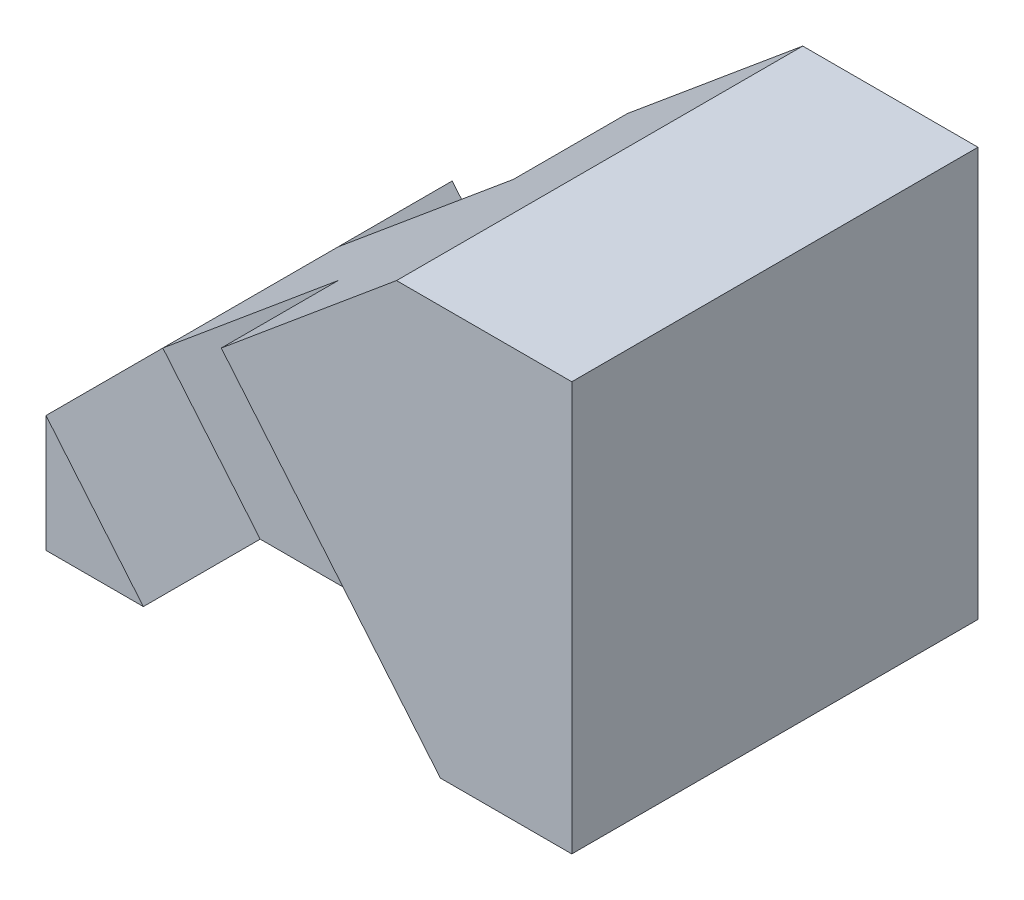
ISO-10303-21;
HEADER;
FILE_DESCRIPTION(('STEP AP214'),'2;1');
FILE_NAME('part.step','',(''),(''),'','','');
FILE_SCHEMA(('AUTOMOTIVE_DESIGN { 1 0 10303 214 1 1 1 1 }'));
ENDSEC;
DATA;
#1=APPLICATION_CONTEXT('core data for automotive mechanical design processes');
#2=APPLICATION_PROTOCOL_DEFINITION('international standard','automotive_design',2000,#1);
#3=PRODUCT_CONTEXT('',#1,'mechanical');
#4=PRODUCT('Part','Part','',(#3));
#5=PRODUCT_RELATED_PRODUCT_CATEGORY('part','',(#4));
#6=PRODUCT_DEFINITION_FORMATION('','',#4);
#7=PRODUCT_DEFINITION_CONTEXT('part definition',#1,'design');
#8=PRODUCT_DEFINITION('design','',#6,#7);
#9=PRODUCT_DEFINITION_SHAPE('','',#8);
#10=(LENGTH_UNIT() NAMED_UNIT(*) SI_UNIT(.MILLI.,.METRE.));
#11=(NAMED_UNIT(*) PLANE_ANGLE_UNIT() SI_UNIT($,.RADIAN.));
#12=(NAMED_UNIT(*) SI_UNIT($,.STERADIAN.) SOLID_ANGLE_UNIT());
#13=UNCERTAINTY_MEASURE_WITH_UNIT(LENGTH_MEASURE(1.E-05),#10,'distance_accuracy_value','');
#14=(GEOMETRIC_REPRESENTATION_CONTEXT(3) GLOBAL_UNCERTAINTY_ASSIGNED_CONTEXT((#13)) GLOBAL_UNIT_ASSIGNED_CONTEXT((#10,
#11,#12)) REPRESENTATION_CONTEXT('',''));
#15=CARTESIAN_POINT('',(0.,0.,0.));
#16=DIRECTION('',(0.,0.,1.));
#17=DIRECTION('',(1.,0.,0.));
#18=AXIS2_PLACEMENT_3D('',#15,#16,#17);
#19=CARTESIAN_POINT('',(0.,0.,0.));
#20=DIRECTION('',(0.,0.,1.));
#21=DIRECTION('',(1.,0.,0.));
#22=AXIS2_PLACEMENT_3D('',#19,#20,#21);
#23=PLANE('',#22);
#24=DIRECTION('',(0.,-1.,0.));
#25=VECTOR('',#24,1.);
#26=CARTESIAN_POINT('',(0.,0.,0.));
#27=LINE('',#26,#25);
#28=CARTESIAN_POINT('',(1.77635683940025E-12,10000.,0.));
#29=VERTEX_POINT('',#28);
#30=CARTESIAN_POINT('',(0.,0.,0.));
#31=VERTEX_POINT('',#30);
#32=EDGE_CURVE('E83',#29,#31,#27,.T.);
#33=ORIENTED_EDGE('',*,*,#32,.F.);
#34=DIRECTION('',(0.64018439966448,-0.768221279597376,0.));
#35=VECTOR('',#34,1.);
#36=CARTESIAN_POINT('',(4918.03278688525,4098.36065573771,0.));
#37=LINE('',#36,#35);
#38=CARTESIAN_POINT('',(8333.33333333334,3.5527136788005E-12,0.));
#39=VERTEX_POINT('',#38);
#40=EDGE_CURVE('E11',#29,#39,#37,.T.);
#41=ORIENTED_EDGE('',*,*,#40,.T.);
#42=DIRECTION('',(1.,0.,0.));
#43=VECTOR('',#42,1.);
#44=CARTESIAN_POINT('',(0.,0.,0.));
#45=LINE('',#44,#43);
#46=EDGE_CURVE('E132',#31,#39,#45,.T.);
#47=ORIENTED_EDGE('',*,*,#46,.F.);
#48=EDGE_LOOP('',(#33,#41,#47));
#49=FACE_BOUND('',#48,.T.);
#50=ADVANCED_FACE('F37',(#49),#23,.F.);
#51=CARTESIAN_POINT('',(0.,0.,34766.0029526665));
#52=DIRECTION('',(0.,0.,1.));
#53=DIRECTION('',(1.,0.,0.));
#54=AXIS2_PLACEMENT_3D('',#51,#52,#53);
#55=PLANE('',#54);
#56=DIRECTION('',(-0.64018439966448,0.768221279597376,0.));
#57=VECTOR('',#56,1.);
#58=CARTESIAN_POINT('',(19918.0327868852,16598.3606557377,34766.0029526665));
#59=LINE('',#58,#57);
#60=CARTESIAN_POINT('',(33750.,-4.44089209850063E-12,34766.0029526665));
#61=VERTEX_POINT('',#60);
#62=CARTESIAN_POINT('',(15000.,22500.,34766.0029526665));
#63=VERTEX_POINT('',#62);
#64=EDGE_CURVE('E153',#61,#63,#59,.T.);
#65=ORIENTED_EDGE('',*,*,#64,.F.);
#66=DIRECTION('',(1.,0.,0.));
#67=VECTOR('',#66,1.);
#68=CARTESIAN_POINT('',(0.,0.,34766.0029526665));
#69=LINE('',#68,#67);
#70=CARTESIAN_POINT('',(45000.,0.,34766.0029526665));
#71=VERTEX_POINT('',#70);
#72=EDGE_CURVE('E92',#61,#71,#69,.T.);
#73=ORIENTED_EDGE('',*,*,#72,.T.);
#74=DIRECTION('',(0.,1.,0.));
#75=VECTOR('',#74,1.);
#76=CARTESIAN_POINT('',(45000.,0.,34766.0029526665));
#77=LINE('',#76,#75);
#78=CARTESIAN_POINT('',(45000.,35000.,34766.0029526665));
#79=VERTEX_POINT('',#78);
#80=EDGE_CURVE('E106',#71,#79,#77,.T.);
#81=ORIENTED_EDGE('',*,*,#80,.T.);
#82=DIRECTION('',(-1.,0.,0.));
#83=VECTOR('',#82,1.);
#84=CARTESIAN_POINT('',(-1.6579330501069E-11,35000.,34766.0029526665));
#85=LINE('',#84,#83);
#86=CARTESIAN_POINT('',(30000.,35000.,34766.0029526665));
#87=VERTEX_POINT('',#86);
#88=EDGE_CURVE('E100',#79,#87,#85,.T.);
#89=ORIENTED_EDGE('',*,*,#88,.T.);
#90=DIRECTION('',(-0.768221279597376,-0.64018439966448,0.));
#91=VECTOR('',#90,1.);
#92=CARTESIAN_POINT('',(-4918.03278688525,5901.6393442623,34766.0029526665));
#93=LINE('',#92,#91);
#94=EDGE_CURVE('E105',#87,#63,#93,.T.);
#95=ORIENTED_EDGE('',*,*,#94,.T.);
#96=EDGE_LOOP('',(#65,#73,#81,#89,#95));
#97=FACE_BOUND('',#96,.T.);
#98=ADVANCED_FACE('F102',(#97),#55,.T.);
#99=CARTESIAN_POINT('',(0.,0.,34766.0029526665));
#100=DIRECTION('',(0.,1.,0.));
#101=DIRECTION('',(0.,0.,1.));
#102=AXIS2_PLACEMENT_3D('',#99,#100,#101);
#103=PLANE('',#102);
#104=ORIENTED_EDGE('',*,*,#46,.T.);
#105=DIRECTION('',(0.,0.,1.));
#106=VECTOR('',#105,1.);
#107=CARTESIAN_POINT('',(8333.33333333334,0.,34766.0029526665));
#108=LINE('',#107,#106);
#109=CARTESIAN_POINT('',(8333.33333333334,3.5527136788005E-12,9766.00295266649));
#110=VERTEX_POINT('',#109);
#111=EDGE_CURVE('E184',#39,#110,#108,.T.);
#112=ORIENTED_EDGE('',*,*,#111,.T.);
#113=DIRECTION('',(1.,0.,0.));
#114=VECTOR('',#113,1.);
#115=CARTESIAN_POINT('',(0.,0.,9766.00295266649));
#116=LINE('',#115,#114);
#117=CARTESIAN_POINT('',(33750.,-2.66453525910038E-12,9766.00295266649));
#118=VERTEX_POINT('',#117);
#119=EDGE_CURVE('E187',#110,#118,#116,.T.);
#120=ORIENTED_EDGE('',*,*,#119,.T.);
#121=DIRECTION('',(0.,0.,-1.));
#122=VECTOR('',#121,1.);
#123=CARTESIAN_POINT('',(33750.,0.,34766.0029526665));
#124=LINE('',#123,#122);
#125=CARTESIAN_POINT('',(33750.,-4.44089209850063E-12,0.));
#126=VERTEX_POINT('',#125);
#127=EDGE_CURVE('E181',#118,#126,#124,.T.);
#128=ORIENTED_EDGE('',*,*,#127,.T.);
#129=CARTESIAN_POINT('',(45000.,0.,0.));
#130=VERTEX_POINT('',#129);
#131=EDGE_CURVE('E136',#126,#130,#45,.T.);
#132=ORIENTED_EDGE('',*,*,#131,.T.);
#133=DIRECTION('',(0.,0.,-1.));
#134=VECTOR('',#133,1.);
#135=CARTESIAN_POINT('',(45000.,0.,34766.0029526665));
#136=LINE('',#135,#134);
#137=EDGE_CURVE('E147',#71,#130,#136,.T.);
#138=ORIENTED_EDGE('',*,*,#137,.F.);
#139=ORIENTED_EDGE('',*,*,#72,.F.);
#140=DIRECTION('',(0.,0.,-1.));
#141=VECTOR('',#140,1.);
#142=CARTESIAN_POINT('',(33750.,0.,34766.0029526665));
#143=LINE('',#142,#141);
#144=CARTESIAN_POINT('',(33750.,-8.88178419700125E-13,24766.0029526665));
#145=VERTEX_POINT('',#144);
#146=EDGE_CURVE('E203',#61,#145,#143,.T.);
#147=ORIENTED_EDGE('',*,*,#146,.T.);
#148=DIRECTION('',(-1.,0.,0.));
#149=VECTOR('',#148,1.);
#150=CARTESIAN_POINT('',(-1.39778898838053E-12,0.,24766.0029526665));
#151=LINE('',#150,#149);
#152=CARTESIAN_POINT('',(8333.33333333334,0.,24766.0029526665));
#153=VERTEX_POINT('',#152);
#154=EDGE_CURVE('E206',#145,#153,#151,.T.);
#155=ORIENTED_EDGE('',*,*,#154,.T.);
#156=DIRECTION('',(0.,0.,1.));
#157=VECTOR('',#156,1.);
#158=CARTESIAN_POINT('',(8333.33333333334,0.,34766.0029526665));
#159=LINE('',#158,#157);
#160=CARTESIAN_POINT('',(8333.33333333334,0.,34766.0029526665));
#161=VERTEX_POINT('',#160);
#162=EDGE_CURVE('E198',#153,#161,#159,.T.);
#163=ORIENTED_EDGE('',*,*,#162,.T.);
#164=CARTESIAN_POINT('',(0.,0.,34766.0029526665));
#165=VERTEX_POINT('',#164);
#166=EDGE_CURVE('E209',#165,#161,#69,.T.);
#167=ORIENTED_EDGE('',*,*,#166,.F.);
#168=DIRECTION('',(0.,0.,-1.));
#169=VECTOR('',#168,1.);
#170=CARTESIAN_POINT('',(0.,0.,34766.0029526665));
#171=LINE('',#170,#169);
#172=EDGE_CURVE('E128',#165,#31,#171,.T.);
#173=ORIENTED_EDGE('',*,*,#172,.T.);
#174=EDGE_LOOP('',(#104,#112,#120,#128,#132,#138,#139,#147,#155,#163,#167,#173));
#175=FACE_BOUND('',#174,.T.);
#176=ADVANCED_FACE('F39',(#175),#103,.F.);
#177=CARTESIAN_POINT('',(45000.,0.,34766.0029526665));
#178=DIRECTION('',(-1.,0.,0.));
#179=DIRECTION('',(0.,0.,1.));
#180=AXIS2_PLACEMENT_3D('',#177,#178,#179);
#181=PLANE('',#180);
#182=DIRECTION('',(0.,1.,0.));
#183=VECTOR('',#182,1.);
#184=CARTESIAN_POINT('',(45000.,0.,0.));
#185=LINE('',#184,#183);
#186=CARTESIAN_POINT('',(45000.,35000.,0.));
#187=VERTEX_POINT('',#186);
#188=EDGE_CURVE('E135',#130,#187,#185,.T.);
#189=ORIENTED_EDGE('',*,*,#188,.T.);
#190=DIRECTION('',(0.,0.,-1.));
#191=VECTOR('',#190,1.);
#192=CARTESIAN_POINT('',(45000.,35000.,34766.0029526665));
#193=LINE('',#192,#191);
#194=EDGE_CURVE('E119',#79,#187,#193,.T.);
#195=ORIENTED_EDGE('',*,*,#194,.F.);
#196=ORIENTED_EDGE('',*,*,#80,.F.);
#197=ORIENTED_EDGE('',*,*,#137,.T.);
#198=EDGE_LOOP('',(#189,#195,#196,#197));
#199=FACE_BOUND('',#198,.T.);
#200=ADVANCED_FACE('F288',(#199),#181,.F.);
#201=CARTESIAN_POINT('',(-1.6579330501069E-11,35000.,34766.0029526665));
#202=DIRECTION('',(0.,-1.,0.));
#203=DIRECTION('',(1.,0.,0.));
#204=AXIS2_PLACEMENT_3D('',#201,#202,#203);
#205=PLANE('',#204);
#206=DIRECTION('',(-1.,0.,0.));
#207=VECTOR('',#206,1.);
#208=CARTESIAN_POINT('',(-1.6579330501069E-11,35000.,0.));
#209=LINE('',#208,#207);
#210=CARTESIAN_POINT('',(30000.,35000.,0.));
#211=VERTEX_POINT('',#210);
#212=EDGE_CURVE('E115',#187,#211,#209,.T.);
#213=ORIENTED_EDGE('',*,*,#212,.T.);
#214=DIRECTION('',(0.,0.,-1.));
#215=VECTOR('',#214,1.);
#216=CARTESIAN_POINT('',(30000.,35000.,34766.0029526665));
#217=LINE('',#216,#215);
#218=EDGE_CURVE('E112',#87,#211,#217,.T.);
#219=ORIENTED_EDGE('',*,*,#218,.F.);
#220=ORIENTED_EDGE('',*,*,#88,.F.);
#221=ORIENTED_EDGE('',*,*,#194,.T.);
#222=EDGE_LOOP('',(#213,#219,#220,#221));
#223=FACE_BOUND('',#222,.T.);
#224=ADVANCED_FACE('F113',(#223),#205,.F.);
#225=CARTESIAN_POINT('',(-4918.03278688525,5901.6393442623,34766.0029526665));
#226=DIRECTION('',(0.64018439966448,-0.768221279597376,0.));
#227=DIRECTION('',(0.768221279597376,0.64018439966448,0.));
#228=AXIS2_PLACEMENT_3D('',#225,#226,#227);
#229=PLANE('',#228);
#230=DIRECTION('',(0.,0.,-1.));
#231=VECTOR('',#230,1.);
#232=CARTESIAN_POINT('',(15000.,22500.,-4.26448476308004E-13));
#233=LINE('',#232,#231);
#234=CARTESIAN_POINT('',(15000.,22500.,9766.00295266649));
#235=VERTEX_POINT('',#234);
#236=CARTESIAN_POINT('',(15000.,22500.,0.));
#237=VERTEX_POINT('',#236);
#238=EDGE_CURVE('E52',#235,#237,#233,.T.);
#239=ORIENTED_EDGE('',*,*,#238,.F.);
#240=DIRECTION('',(0.768221279597376,0.64018439966448,0.));
#241=VECTOR('',#240,1.);
#242=CARTESIAN_POINT('',(-4918.03278688525,5901.6393442623,9766.00295266649));
#243=LINE('',#242,#241);
#244=CARTESIAN_POINT('',(1.42929874950158E-12,10000.,9766.00295266649));
#245=VERTEX_POINT('',#244);
#246=EDGE_CURVE('E167',#245,#235,#243,.T.);
#247=ORIENTED_EDGE('',*,*,#246,.F.);
#248=DIRECTION('',(0.,0.,-1.));
#249=VECTOR('',#248,1.);
#250=CARTESIAN_POINT('',(8.88178419700125E-13,10000.,34766.0029526665));
#251=LINE('',#250,#249);
#252=CARTESIAN_POINT('',(8.96238154116573E-13,10000.,24766.0029526665));
#253=VERTEX_POINT('',#252);
#254=EDGE_CURVE('E143',#253,#245,#251,.T.);
#255=ORIENTED_EDGE('',*,*,#254,.F.);
#256=DIRECTION('',(-0.768221279597376,-0.64018439966448,0.));
#257=VECTOR('',#256,1.);
#258=CARTESIAN_POINT('',(-4918.03278688525,5901.6393442623,24766.0029526665));
#259=LINE('',#258,#257);
#260=CARTESIAN_POINT('',(15000.,22500.,24766.0029526665));
#261=VERTEX_POINT('',#260);
#262=EDGE_CURVE('E191',#261,#253,#259,.T.);
#263=ORIENTED_EDGE('',*,*,#262,.F.);
#264=DIRECTION('',(0.,0.,-1.));
#265=VECTOR('',#264,1.);
#266=CARTESIAN_POINT('',(15000.,22500.,-1.33996775247147E-11));
#267=LINE('',#266,#265);
#268=EDGE_CURVE('E126',#63,#261,#267,.T.);
#269=ORIENTED_EDGE('',*,*,#268,.F.);
#270=ORIENTED_EDGE('',*,*,#94,.F.);
#271=ORIENTED_EDGE('',*,*,#218,.T.);
#272=DIRECTION('',(-0.768221279597376,-0.64018439966448,0.));
#273=VECTOR('',#272,1.);
#274=CARTESIAN_POINT('',(-4918.03278688525,5901.6393442623,0.));
#275=LINE('',#274,#273);
#276=EDGE_CURVE('E139',#211,#237,#275,.T.);
#277=ORIENTED_EDGE('',*,*,#276,.T.);
#278=EDGE_LOOP('',(#239,#247,#255,#263,#269,#270,#271,#277));
#279=FACE_BOUND('',#278,.T.);
#280=ADVANCED_FACE('F123',(#279),#229,.F.);
#281=CARTESIAN_POINT('',(0.,0.,34766.0029526665));
#282=DIRECTION('',(1.,0.,0.));
#283=DIRECTION('',(0.,1.,0.));
#284=AXIS2_PLACEMENT_3D('',#281,#282,#283);
#285=PLANE('',#284);
#286=ORIENTED_EDGE('',*,*,#32,.T.);
#287=ORIENTED_EDGE('',*,*,#172,.F.);
#288=DIRECTION('',(0.,-1.,0.));
#289=VECTOR('',#288,1.);
#290=CARTESIAN_POINT('',(0.,0.,34766.0029526665));
#291=LINE('',#290,#289);
#292=CARTESIAN_POINT('',(8.88178419700125E-13,10000.,34766.0029526665));
#293=VERTEX_POINT('',#292);
#294=EDGE_CURVE('E61',#293,#165,#291,.T.);
#295=ORIENTED_EDGE('',*,*,#294,.F.);
#296=EDGE_CURVE('E120',#293,#253,#251,.T.);
#297=ORIENTED_EDGE('',*,*,#296,.T.);
#298=ORIENTED_EDGE('',*,*,#254,.T.);
#299=DIRECTION('',(0.,0.,1.));
#300=VECTOR('',#299,1.);
#301=CARTESIAN_POINT('',(1.77635683940025E-12,10000.,-4.26448476308003E-13));
#302=LINE('',#301,#300);
#303=EDGE_CURVE('E171',#29,#245,#302,.T.);
#304=ORIENTED_EDGE('',*,*,#303,.F.);
#305=EDGE_LOOP('',(#286,#287,#295,#297,#298,#304));
#306=FACE_BOUND('',#305,.T.);
#307=ADVANCED_FACE('F230',(#306),#285,.F.);
#308=DIRECTION('',(0.64018439966448,-0.768221279597376,0.));
#309=VECTOR('',#308,1.);
#310=CARTESIAN_POINT('',(4918.03278688525,4098.36065573771,34766.0029526665));
#311=LINE('',#310,#309);
#312=EDGE_CURVE('E150',#293,#161,#311,.T.);
#313=ORIENTED_EDGE('',*,*,#312,.F.);
#314=ORIENTED_EDGE('',*,*,#294,.T.);
#315=ORIENTED_EDGE('',*,*,#166,.T.);
#316=EDGE_LOOP('',(#313,#314,#315));
#317=FACE_BOUND('',#316,.T.);
#318=ADVANCED_FACE('F212',(#317),#55,.T.);
#319=ORIENTED_EDGE('',*,*,#131,.F.);
#320=DIRECTION('',(-0.64018439966448,0.768221279597376,0.));
#321=VECTOR('',#320,1.);
#322=CARTESIAN_POINT('',(19918.0327868852,16598.3606557377,0.));
#323=LINE('',#322,#321);
#324=EDGE_CURVE('E45',#126,#237,#323,.T.);
#325=ORIENTED_EDGE('',*,*,#324,.T.);
#326=ORIENTED_EDGE('',*,*,#276,.F.);
#327=ORIENTED_EDGE('',*,*,#212,.F.);
#328=ORIENTED_EDGE('',*,*,#188,.F.);
#329=EDGE_LOOP('',(#319,#325,#326,#327,#328));
#330=FACE_BOUND('',#329,.T.);
#331=ADVANCED_FACE('F157',(#330),#23,.F.);
#332=CARTESIAN_POINT('',(17487.7810169719,-20985.3372203663,24766.0029526665));
#333=DIRECTION('',(0.,0.,-1.));
#334=DIRECTION('',(-1.,0.,0.));
#335=AXIS2_PLACEMENT_3D('',#332,#333,#334);
#336=PLANE('',#335);
#337=DIRECTION('',(-0.64018439966448,0.768221279597376,0.));
#338=VECTOR('',#337,1.);
#339=CARTESIAN_POINT('',(37405.8138038571,-4386.97656462857,24766.0029526665));
#340=LINE('',#339,#338);
#341=EDGE_CURVE('E194',#145,#261,#340,.T.);
#342=ORIENTED_EDGE('',*,*,#341,.T.);
#343=ORIENTED_EDGE('',*,*,#262,.T.);
#344=DIRECTION('',(-0.64018439966448,0.768221279597376,0.));
#345=VECTOR('',#344,1.);
#346=CARTESIAN_POINT('',(22405.8138038571,-16886.9765646286,24766.0029526665));
#347=LINE('',#346,#345);
#348=EDGE_CURVE('E195',#153,#253,#347,.T.);
#349=ORIENTED_EDGE('',*,*,#348,.F.);
#350=ORIENTED_EDGE('',*,*,#154,.F.);
#351=EDGE_LOOP('',(#342,#343,#349,#350));
#352=FACE_BOUND('',#351,.T.);
#353=ADVANCED_FACE('F226',(#352),#336,.F.);
#354=CARTESIAN_POINT('',(37405.8138038571,-4386.97656462858,-1.33996775247147E-11));
#355=DIRECTION('',(0.768221279597376,0.64018439966448,0.));
#356=DIRECTION('',(-0.64018439966448,0.768221279597376,0.));
#357=AXIS2_PLACEMENT_3D('',#354,#355,#356);
#358=PLANE('',#357);
#359=ORIENTED_EDGE('',*,*,#64,.T.);
#360=ORIENTED_EDGE('',*,*,#268,.T.);
#361=ORIENTED_EDGE('',*,*,#341,.F.);
#362=ORIENTED_EDGE('',*,*,#146,.F.);
#363=EDGE_LOOP('',(#359,#360,#361,#362));
#364=FACE_BOUND('',#363,.T.);
#365=ADVANCED_FACE('F249',(#364),#358,.F.);
#366=CARTESIAN_POINT('',(22405.8138038571,-16886.9765646286,-4.26448476308003E-13));
#367=DIRECTION('',(-0.768221279597376,-0.64018439966448,0.));
#368=DIRECTION('',(0.64018439966448,-0.768221279597376,0.));
#369=AXIS2_PLACEMENT_3D('',#366,#367,#368);
#370=PLANE('',#369);
#371=ORIENTED_EDGE('',*,*,#348,.T.);
#372=ORIENTED_EDGE('',*,*,#296,.F.);
#373=ORIENTED_EDGE('',*,*,#312,.T.);
#374=ORIENTED_EDGE('',*,*,#162,.F.);
#375=EDGE_LOOP('',(#371,#372,#373,#374));
#376=FACE_BOUND('',#375,.T.);
#377=ADVANCED_FACE('F222',(#376),#370,.F.);
#378=CARTESIAN_POINT('',(17487.7810169719,-20985.3372203663,9766.00295266649));
#379=DIRECTION('',(0.,0.,1.));
#380=DIRECTION('',(1.,0.,0.));
#381=AXIS2_PLACEMENT_3D('',#378,#379,#380);
#382=PLANE('',#381);
#383=DIRECTION('',(-0.64018439966448,0.768221279597376,0.));
#384=VECTOR('',#383,1.);
#385=CARTESIAN_POINT('',(22405.8138038571,-16886.9765646286,9766.00295266649));
#386=LINE('',#385,#384);
#387=EDGE_CURVE('E178',#110,#245,#386,.T.);
#388=ORIENTED_EDGE('',*,*,#387,.T.);
#389=ORIENTED_EDGE('',*,*,#246,.T.);
#390=DIRECTION('',(-0.64018439966448,0.768221279597376,0.));
#391=VECTOR('',#390,1.);
#392=CARTESIAN_POINT('',(37405.8138038571,-4386.97656462856,9766.00295266649));
#393=LINE('',#392,#391);
#394=EDGE_CURVE('E174',#118,#235,#393,.T.);
#395=ORIENTED_EDGE('',*,*,#394,.F.);
#396=ORIENTED_EDGE('',*,*,#119,.F.);
#397=EDGE_LOOP('',(#388,#389,#395,#396));
#398=FACE_BOUND('',#397,.T.);
#399=ADVANCED_FACE('F259',(#398),#382,.F.);
#400=CARTESIAN_POINT('',(22405.8138038571,-16886.9765646286,-4.26448476308003E-13));
#401=DIRECTION('',(-0.768221279597376,-0.64018439966448,0.));
#402=DIRECTION('',(0.64018439966448,-0.768221279597376,0.));
#403=AXIS2_PLACEMENT_3D('',#400,#401,#402);
#404=PLANE('',#403);
#405=ORIENTED_EDGE('',*,*,#40,.F.);
#406=ORIENTED_EDGE('',*,*,#303,.T.);
#407=ORIENTED_EDGE('',*,*,#387,.F.);
#408=ORIENTED_EDGE('',*,*,#111,.F.);
#409=EDGE_LOOP('',(#405,#406,#407,#408));
#410=FACE_BOUND('',#409,.T.);
#411=ADVANCED_FACE('F262',(#410),#404,.F.);
#412=CARTESIAN_POINT('',(37405.8138038571,-4386.97656462856,-4.26448476308004E-13));
#413=DIRECTION('',(0.768221279597376,0.64018439966448,0.));
#414=DIRECTION('',(-0.64018439966448,0.768221279597376,0.));
#415=AXIS2_PLACEMENT_3D('',#412,#413,#414);
#416=PLANE('',#415);
#417=ORIENTED_EDGE('',*,*,#394,.T.);
#418=ORIENTED_EDGE('',*,*,#238,.T.);
#419=ORIENTED_EDGE('',*,*,#324,.F.);
#420=ORIENTED_EDGE('',*,*,#127,.F.);
#421=EDGE_LOOP('',(#417,#418,#419,#420));
#422=FACE_BOUND('',#421,.T.);
#423=ADVANCED_FACE('F264',(#422),#416,.F.);
#424=CLOSED_SHELL('',(#50,#98,#176,#200,#224,#280,#307,#318,#331,#353,#365,#377,#399,#411,#423));
#425=MANIFOLD_SOLID_BREP('B2',#424);
#426=ADVANCED_BREP_SHAPE_REPRESENTATION('',(#18,#425),#14);
#427=SHAPE_DEFINITION_REPRESENTATION(#9,#426);
ENDSEC;
END-ISO-10303-21;
